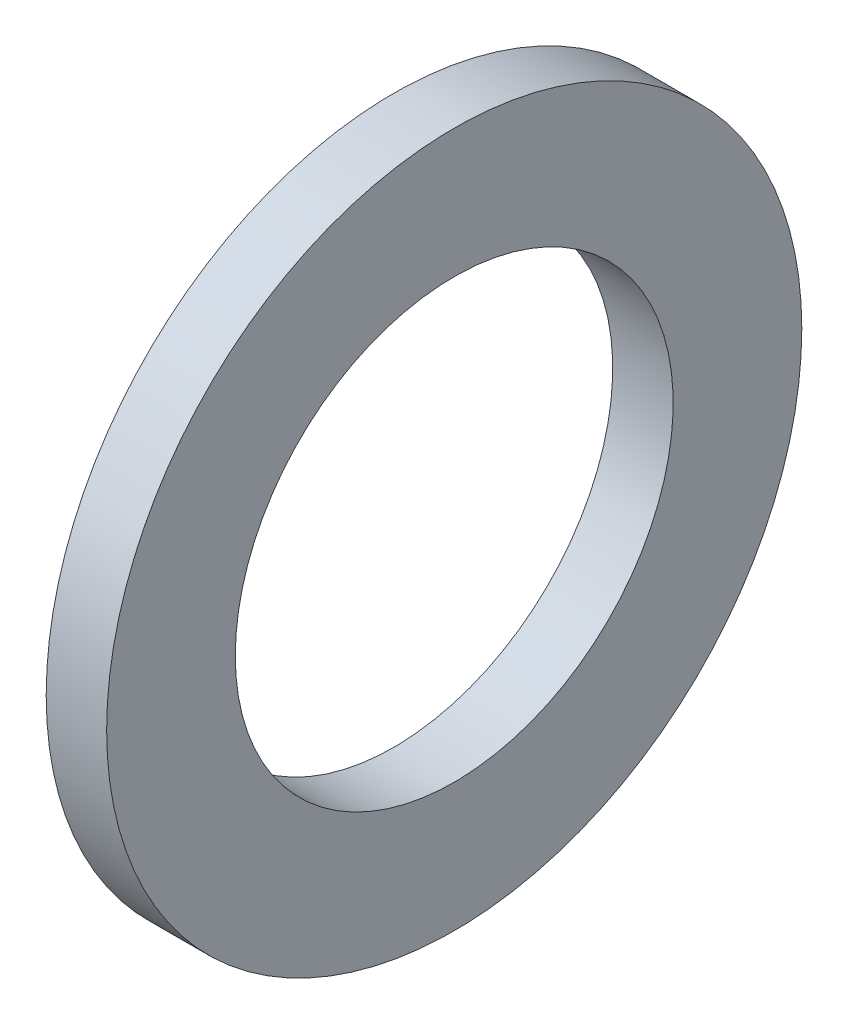
ISO-10303-21;
HEADER;
FILE_DESCRIPTION(('STEP AP214'),'2;1');
FILE_NAME('part.step','',(''),(''),'','','');
FILE_SCHEMA(('AUTOMOTIVE_DESIGN { 1 0 10303 214 1 1 1 1 }'));
ENDSEC;
DATA;
#1=APPLICATION_CONTEXT('core data for automotive mechanical design processes');
#2=APPLICATION_PROTOCOL_DEFINITION('international standard','automotive_design',2000,#1);
#3=PRODUCT_CONTEXT('',#1,'mechanical');
#4=PRODUCT('Part','Part','',(#3));
#5=PRODUCT_RELATED_PRODUCT_CATEGORY('part','',(#4));
#6=PRODUCT_DEFINITION_FORMATION('','',#4);
#7=PRODUCT_DEFINITION_CONTEXT('part definition',#1,'design');
#8=PRODUCT_DEFINITION('design','',#6,#7);
#9=PRODUCT_DEFINITION_SHAPE('','',#8);
#10=(LENGTH_UNIT() NAMED_UNIT(*) SI_UNIT(.MILLI.,.METRE.));
#11=(NAMED_UNIT(*) PLANE_ANGLE_UNIT() SI_UNIT($,.RADIAN.));
#12=(NAMED_UNIT(*) SI_UNIT($,.STERADIAN.) SOLID_ANGLE_UNIT());
#13=UNCERTAINTY_MEASURE_WITH_UNIT(LENGTH_MEASURE(1.E-05),#10,'distance_accuracy_value','');
#14=(GEOMETRIC_REPRESENTATION_CONTEXT(3) GLOBAL_UNCERTAINTY_ASSIGNED_CONTEXT((#13)) GLOBAL_UNIT_ASSIGNED_CONTEXT((#10,
#11,#12)) REPRESENTATION_CONTEXT('',''));
#15=CARTESIAN_POINT('',(0.,0.,0.));
#16=DIRECTION('',(0.,0.,1.));
#17=DIRECTION('',(1.,0.,0.));
#18=AXIS2_PLACEMENT_3D('',#15,#16,#17);
#19=CARTESIAN_POINT('',(0.,1.84,0.));
#20=DIRECTION('',(-1.,0.,0.));
#21=DIRECTION('',(0.,0.,1.));
#22=AXIS2_PLACEMENT_3D('',#19,#20,#21);
#23=PLANE('',#22);
#24=CARTESIAN_POINT('',(0.,0.,0.));
#25=DIRECTION('',(-1.,0.,0.));
#26=DIRECTION('',(0.,0.,1.));
#27=AXIS2_PLACEMENT_3D('',#24,#25,#26);
#28=CIRCLE('',#27,1.84);
#29=CARTESIAN_POINT('',(0.,0.,1.84));
#30=VERTEX_POINT('',#29);
#31=EDGE_CURVE('E18',#30,#30,#28,.T.);
#32=ORIENTED_EDGE('',*,*,#31,.T.);
#33=EDGE_LOOP('',(#32));
#34=FACE_BOUND('',#33,.T.);
#35=CARTESIAN_POINT('',(0.,0.,0.));
#36=DIRECTION('',(-1.,0.,0.));
#37=DIRECTION('',(0.,0.,1.));
#38=AXIS2_PLACEMENT_3D('',#35,#36,#37);
#39=CIRCLE('',#38,2.921);
#40=CARTESIAN_POINT('',(0.,0.,2.921));
#41=VERTEX_POINT('',#40);
#42=EDGE_CURVE('E27',#41,#41,#39,.T.);
#43=ORIENTED_EDGE('',*,*,#42,.F.);
#44=EDGE_LOOP('',(#43));
#45=FACE_BOUND('',#44,.T.);
#46=ADVANCED_FACE('F15',(#34,#45),#23,.F.);
#47=CARTESIAN_POINT('',(-34.9249999999999,0.,0.));
#48=DIRECTION('',(-1.,0.,0.));
#49=DIRECTION('',(0.,0.,1.));
#50=AXIS2_PLACEMENT_3D('',#47,#48,#49);
#51=CYLINDRICAL_SURFACE('',#50,1.84);
#52=ORIENTED_EDGE('',*,*,#31,.F.);
#53=EDGE_LOOP('',(#52));
#54=FACE_BOUND('',#53,.T.);
#55=CARTESIAN_POINT('',(-0.508000000000002,0.,0.));
#56=DIRECTION('',(-1.,0.,0.));
#57=DIRECTION('',(0.,0.,1.));
#58=AXIS2_PLACEMENT_3D('',#55,#56,#57);
#59=CIRCLE('',#58,1.84);
#60=CARTESIAN_POINT('',(-0.508000000000002,0.,1.84));
#61=VERTEX_POINT('',#60);
#62=EDGE_CURVE('E22',#61,#61,#59,.T.);
#63=ORIENTED_EDGE('',*,*,#62,.T.);
#64=EDGE_LOOP('',(#63));
#65=FACE_BOUND('',#64,.T.);
#66=ADVANCED_FACE('F37',(#54,#65),#51,.F.);
#67=CARTESIAN_POINT('',(-34.9249999999999,0.,0.));
#68=DIRECTION('',(-1.,0.,0.));
#69=DIRECTION('',(0.,0.,1.));
#70=AXIS2_PLACEMENT_3D('',#67,#68,#69);
#71=CYLINDRICAL_SURFACE('',#70,2.921);
#72=CARTESIAN_POINT('',(-0.508000000000002,0.,0.));
#73=DIRECTION('',(-1.,0.,0.));
#74=DIRECTION('',(0.,0.,1.));
#75=AXIS2_PLACEMENT_3D('',#72,#73,#74);
#76=CIRCLE('',#75,2.921);
#77=CARTESIAN_POINT('',(-0.508000000000002,0.,2.921));
#78=VERTEX_POINT('',#77);
#79=EDGE_CURVE('E10',#78,#78,#76,.F.);
#80=ORIENTED_EDGE('',*,*,#79,.T.);
#81=EDGE_LOOP('',(#80));
#82=FACE_BOUND('',#81,.T.);
#83=ORIENTED_EDGE('',*,*,#42,.T.);
#84=EDGE_LOOP('',(#83));
#85=FACE_BOUND('',#84,.T.);
#86=ADVANCED_FACE('F40',(#82,#85),#71,.T.);
#87=CARTESIAN_POINT('',(-0.508000000000001,2.921,0.));
#88=DIRECTION('',(1.,0.,0.));
#89=DIRECTION('',(0.,0.,-1.));
#90=AXIS2_PLACEMENT_3D('',#87,#88,#89);
#91=PLANE('',#90);
#92=ORIENTED_EDGE('',*,*,#79,.F.);
#93=EDGE_LOOP('',(#92));
#94=FACE_BOUND('',#93,.T.);
#95=ORIENTED_EDGE('',*,*,#62,.F.);
#96=EDGE_LOOP('',(#95));
#97=FACE_BOUND('',#96,.T.);
#98=ADVANCED_FACE('F43',(#94,#97),#91,.F.);
#99=CLOSED_SHELL('',(#46,#66,#86,#98));
#100=MANIFOLD_SOLID_BREP('B1',#99);
#101=ADVANCED_BREP_SHAPE_REPRESENTATION('',(#18,#100),#14);
#102=SHAPE_DEFINITION_REPRESENTATION(#9,#101);
ENDSEC;
END-ISO-10303-21;
